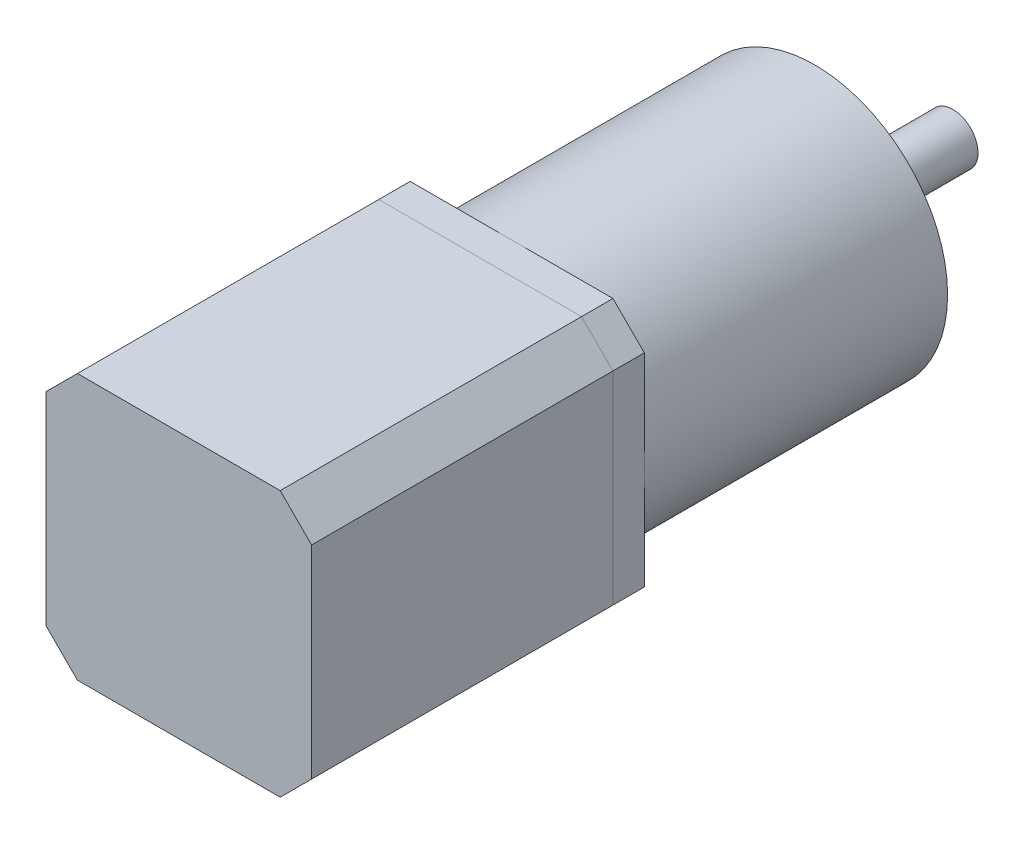
ISO-10303-21;
HEADER;
FILE_DESCRIPTION(('STEP AP214'),'2;1');
FILE_NAME('part.step','',(''),(''),'','','');
FILE_SCHEMA(('AUTOMOTIVE_DESIGN { 1 0 10303 214 1 1 1 1 }'));
ENDSEC;
DATA;
#1=APPLICATION_CONTEXT('core data for automotive mechanical design processes');
#2=APPLICATION_PROTOCOL_DEFINITION('international standard','automotive_design',2000,#1);
#3=PRODUCT_CONTEXT('',#1,'mechanical');
#4=PRODUCT('Part','Part','',(#3));
#5=PRODUCT_RELATED_PRODUCT_CATEGORY('part','',(#4));
#6=PRODUCT_DEFINITION_FORMATION('','',#4);
#7=PRODUCT_DEFINITION_CONTEXT('part definition',#1,'design');
#8=PRODUCT_DEFINITION('design','',#6,#7);
#9=PRODUCT_DEFINITION_SHAPE('','',#8);
#10=(LENGTH_UNIT() NAMED_UNIT(*) SI_UNIT(.MILLI.,.METRE.));
#11=(NAMED_UNIT(*) PLANE_ANGLE_UNIT() SI_UNIT($,.RADIAN.));
#12=(NAMED_UNIT(*) SI_UNIT($,.STERADIAN.) SOLID_ANGLE_UNIT());
#13=UNCERTAINTY_MEASURE_WITH_UNIT(LENGTH_MEASURE(1.E-05),#10,'distance_accuracy_value','');
#14=(GEOMETRIC_REPRESENTATION_CONTEXT(3) GLOBAL_UNCERTAINTY_ASSIGNED_CONTEXT((#13)) GLOBAL_UNIT_ASSIGNED_CONTEXT((#10,
#11,#12)) REPRESENTATION_CONTEXT('',''));
#15=CARTESIAN_POINT('',(0.,0.,0.));
#16=DIRECTION('',(0.,0.,1.));
#17=DIRECTION('',(1.,0.,0.));
#18=AXIS2_PLACEMENT_3D('',#15,#16,#17);
#19=CARTESIAN_POINT('',(0.,0.,-55.8));
#20=DIRECTION('',(0.,0.,1.));
#21=DIRECTION('',(1.,0.,0.));
#22=AXIS2_PLACEMENT_3D('',#19,#20,#21);
#23=CYLINDRICAL_SURFACE('',#22,6.21097509165244);
#24=CARTESIAN_POINT('',(0.,0.,-55.8));
#25=DIRECTION('',(0.,0.,-1.));
#26=DIRECTION('',(-1.,0.,0.));
#27=AXIS2_PLACEMENT_3D('',#24,#25,#26);
#28=CIRCLE('',#27,6.21097509165244);
#29=CARTESIAN_POINT('',(-6.21097509165244,0.,-55.8));
#30=VERTEX_POINT('',#29);
#31=EDGE_CURVE('E11',#30,#30,#28,.T.);
#32=ORIENTED_EDGE('',*,*,#31,.F.);
#33=EDGE_LOOP('',(#32));
#34=FACE_BOUND('',#33,.T.);
#35=CARTESIAN_POINT('',(0.,0.,-55.3));
#36=DIRECTION('',(0.,0.,-1.));
#37=DIRECTION('',(-1.,0.,0.));
#38=AXIS2_PLACEMENT_3D('',#35,#36,#37);
#39=CIRCLE('',#38,6.21097509165244);
#40=CARTESIAN_POINT('',(-6.21097509165244,0.,-55.3));
#41=VERTEX_POINT('',#40);
#42=EDGE_CURVE('E44',#41,#41,#39,.T.);
#43=ORIENTED_EDGE('',*,*,#42,.T.);
#44=EDGE_LOOP('',(#43));
#45=FACE_BOUND('',#44,.T.);
#46=ADVANCED_FACE('F41',(#34,#45),#23,.T.);
#47=CARTESIAN_POINT('',(0.,0.,-55.8));
#48=DIRECTION('',(0.,0.,-1.));
#49=DIRECTION('',(-1.,0.,0.));
#50=AXIS2_PLACEMENT_3D('',#47,#48,#49);
#51=PLANE('',#50);
#52=ORIENTED_EDGE('',*,*,#31,.T.);
#53=EDGE_LOOP('',(#52));
#54=FACE_BOUND('',#53,.T.);
#55=ADVANCED_FACE('F56',(#54),#51,.T.);
#56=CARTESIAN_POINT('',(0.,0.,-55.3));
#57=DIRECTION('',(0.,0.,-1.));
#58=DIRECTION('',(-1.,0.,0.));
#59=AXIS2_PLACEMENT_3D('',#56,#57,#58);
#60=PLANE('',#59);
#61=ORIENTED_EDGE('',*,*,#42,.F.);
#62=EDGE_LOOP('',(#61));
#63=FACE_BOUND('',#62,.T.);
#64=ADVANCED_FACE('F54',(#63),#60,.F.);
#65=CLOSED_SHELL('',(#46,#55,#64));
#66=MANIFOLD_SOLID_BREP('B2',#65);
#67=CARTESIAN_POINT('',(0.,0.,-75.3));
#68=DIRECTION('',(0.,0.,1.));
#69=DIRECTION('',(1.,0.,0.));
#70=AXIS2_PLACEMENT_3D('',#67,#68,#69);
#71=CYLINDRICAL_SURFACE('',#70,4.);
#72=CARTESIAN_POINT('',(0.,0.,-75.3));
#73=DIRECTION('',(0.,0.,-1.));
#74=DIRECTION('',(-1.,0.,0.));
#75=AXIS2_PLACEMENT_3D('',#72,#73,#74);
#76=CIRCLE('',#75,4.);
#77=CARTESIAN_POINT('',(-4.,0.,-75.3));
#78=VERTEX_POINT('',#77);
#79=EDGE_CURVE('E40',#78,#78,#76,.T.);
#80=ORIENTED_EDGE('',*,*,#79,.F.);
#81=EDGE_LOOP('',(#80));
#82=FACE_BOUND('',#81,.T.);
#83=CARTESIAN_POINT('',(0.,0.,-55.3));
#84=DIRECTION('',(0.,0.,-1.));
#85=DIRECTION('',(-1.,0.,0.));
#86=AXIS2_PLACEMENT_3D('',#83,#84,#85);
#87=CIRCLE('',#86,4.);
#88=CARTESIAN_POINT('',(-4.,0.,-55.3));
#89=VERTEX_POINT('',#88);
#90=EDGE_CURVE('E92',#89,#89,#87,.T.);
#91=ORIENTED_EDGE('',*,*,#90,.T.);
#92=EDGE_LOOP('',(#91));
#93=FACE_BOUND('',#92,.T.);
#94=ADVANCED_FACE('F89',(#82,#93),#71,.T.);
#95=CARTESIAN_POINT('',(0.,0.,-75.3));
#96=DIRECTION('',(0.,0.,-1.));
#97=DIRECTION('',(-1.,0.,0.));
#98=AXIS2_PLACEMENT_3D('',#95,#96,#97);
#99=PLANE('',#98);
#100=ORIENTED_EDGE('',*,*,#79,.T.);
#101=EDGE_LOOP('',(#100));
#102=FACE_BOUND('',#101,.T.);
#103=ADVANCED_FACE('F104',(#102),#99,.T.);
#104=CARTESIAN_POINT('',(0.,0.,-55.3));
#105=DIRECTION('',(0.,0.,-1.));
#106=DIRECTION('',(-1.,0.,0.));
#107=AXIS2_PLACEMENT_3D('',#104,#105,#106);
#108=PLANE('',#107);
#109=ORIENTED_EDGE('',*,*,#90,.F.);
#110=EDGE_LOOP('',(#109));
#111=FACE_BOUND('',#110,.T.);
#112=ADVANCED_FACE('F102',(#111),#108,.F.);
#113=CLOSED_SHELL('',(#94,#103,#112));
#114=MANIFOLD_SOLID_BREP('B6',#113);
#115=CARTESIAN_POINT('',(0.,0.,-55.3));
#116=DIRECTION('',(0.,0.,1.));
#117=DIRECTION('',(1.,0.,0.));
#118=AXIS2_PLACEMENT_3D('',#115,#116,#117);
#119=CYLINDRICAL_SURFACE('',#118,11.);
#120=CARTESIAN_POINT('',(0.,0.,-55.3));
#121=DIRECTION('',(0.,0.,-1.));
#122=DIRECTION('',(-1.,0.,0.));
#123=AXIS2_PLACEMENT_3D('',#120,#121,#122);
#124=CIRCLE('',#123,11.);
#125=CARTESIAN_POINT('',(-11.,0.,-55.3));
#126=VERTEX_POINT('',#125);
#127=EDGE_CURVE('E88',#126,#126,#124,.T.);
#128=ORIENTED_EDGE('',*,*,#127,.F.);
#129=EDGE_LOOP('',(#128));
#130=FACE_BOUND('',#129,.T.);
#131=CARTESIAN_POINT('',(0.,0.,-53.3));
#132=DIRECTION('',(0.,0.,-1.));
#133=DIRECTION('',(-1.,0.,0.));
#134=AXIS2_PLACEMENT_3D('',#131,#132,#133);
#135=CIRCLE('',#134,11.);
#136=CARTESIAN_POINT('',(-11.,0.,-53.3));
#137=VERTEX_POINT('',#136);
#138=EDGE_CURVE('E140',#137,#137,#135,.T.);
#139=ORIENTED_EDGE('',*,*,#138,.T.);
#140=EDGE_LOOP('',(#139));
#141=FACE_BOUND('',#140,.T.);
#142=ADVANCED_FACE('F137',(#130,#141),#119,.T.);
#143=CARTESIAN_POINT('',(0.,0.,-55.3));
#144=DIRECTION('',(0.,0.,-1.));
#145=DIRECTION('',(-1.,0.,0.));
#146=AXIS2_PLACEMENT_3D('',#143,#144,#145);
#147=PLANE('',#146);
#148=ORIENTED_EDGE('',*,*,#127,.T.);
#149=EDGE_LOOP('',(#148));
#150=FACE_BOUND('',#149,.T.);
#151=ADVANCED_FACE('F152',(#150),#147,.T.);
#152=CARTESIAN_POINT('',(0.,0.,-53.3));
#153=DIRECTION('',(0.,0.,-1.));
#154=DIRECTION('',(-1.,0.,0.));
#155=AXIS2_PLACEMENT_3D('',#152,#153,#154);
#156=PLANE('',#155);
#157=ORIENTED_EDGE('',*,*,#138,.F.);
#158=EDGE_LOOP('',(#157));
#159=FACE_BOUND('',#158,.T.);
#160=ADVANCED_FACE('F150',(#159),#156,.F.);
#161=CLOSED_SHELL('',(#142,#151,#160));
#162=MANIFOLD_SOLID_BREP('B35',#161);
#163=CARTESIAN_POINT('',(0.,0.,-53.3));
#164=DIRECTION('',(0.,0.,1.));
#165=DIRECTION('',(1.,0.,0.));
#166=AXIS2_PLACEMENT_3D('',#163,#164,#165);
#167=CYLINDRICAL_SURFACE('',#166,21.15);
#168=CARTESIAN_POINT('',(0.,0.,-53.3));
#169=DIRECTION('',(0.,0.,-1.));
#170=DIRECTION('',(-1.,0.,0.));
#171=AXIS2_PLACEMENT_3D('',#168,#169,#170);
#172=CIRCLE('',#171,21.15);
#173=CARTESIAN_POINT('',(21.15,0.,-53.3));
#174=VERTEX_POINT('',#173);
#175=EDGE_CURVE('E136',#174,#174,#172,.T.);
#176=CARTESIAN_POINT('',(0.,0.,-5.));
#177=DIRECTION('',(0.,0.,-1.));
#178=DIRECTION('',(-1.,0.,0.));
#179=AXIS2_PLACEMENT_3D('',#176,#177,#178);
#180=CIRCLE('',#179,21.15);
#181=CARTESIAN_POINT('',(21.15,0.,-5.));
#182=VERTEX_POINT('',#181);
#183=EDGE_CURVE('E190',#182,#182,#180,.T.);
#184=CARTESIAN_POINT('',(21.15,0.,-53.3));
#185=CARTESIAN_POINT('',(21.15,0.,-52.796875));
#186=CARTESIAN_POINT('',(21.15,0.,-52.29375));
#187=CARTESIAN_POINT('',(21.15,0.,-51.2875));
#188=CARTESIAN_POINT('',(21.15,0.,-50.784375));
#189=CARTESIAN_POINT('',(21.15,0.,-49.778125));
#190=CARTESIAN_POINT('',(21.15,0.,-49.275));
#191=CARTESIAN_POINT('',(21.15,0.,-48.26875));
#192=CARTESIAN_POINT('',(21.15,0.,-47.765625));
#193=CARTESIAN_POINT('',(21.15,0.,-46.759375));
#194=CARTESIAN_POINT('',(21.15,0.,-46.25625));
#195=CARTESIAN_POINT('',(21.15,0.,-45.25));
#196=CARTESIAN_POINT('',(21.15,0.,-44.746875));
#197=CARTESIAN_POINT('',(21.15,0.,-43.740625));
#198=CARTESIAN_POINT('',(21.15,0.,-43.2375));
#199=CARTESIAN_POINT('',(21.15,0.,-42.23125));
#200=CARTESIAN_POINT('',(21.15,0.,-41.728125));
#201=CARTESIAN_POINT('',(21.15,0.,-40.721875));
#202=CARTESIAN_POINT('',(21.15,0.,-40.21875));
#203=CARTESIAN_POINT('',(21.15,0.,-39.2125));
#204=CARTESIAN_POINT('',(21.15,0.,-38.709375));
#205=CARTESIAN_POINT('',(21.15,0.,-37.703125));
#206=CARTESIAN_POINT('',(21.15,0.,-37.2));
#207=CARTESIAN_POINT('',(21.15,0.,-36.19375));
#208=CARTESIAN_POINT('',(21.15,0.,-35.690625));
#209=CARTESIAN_POINT('',(21.15,0.,-34.684375));
#210=CARTESIAN_POINT('',(21.15,0.,-34.18125));
#211=CARTESIAN_POINT('',(21.15,0.,-33.175));
#212=CARTESIAN_POINT('',(21.15,0.,-32.671875));
#213=CARTESIAN_POINT('',(21.15,0.,-31.665625));
#214=CARTESIAN_POINT('',(21.15,0.,-31.1625));
#215=CARTESIAN_POINT('',(21.15,0.,-30.15625));
#216=CARTESIAN_POINT('',(21.15,0.,-29.653125));
#217=CARTESIAN_POINT('',(21.15,0.,-28.646875));
#218=CARTESIAN_POINT('',(21.15,0.,-28.14375));
#219=CARTESIAN_POINT('',(21.15,0.,-27.1375));
#220=CARTESIAN_POINT('',(21.15,0.,-26.634375));
#221=CARTESIAN_POINT('',(21.15,0.,-25.628125));
#222=CARTESIAN_POINT('',(21.15,0.,-25.125));
#223=CARTESIAN_POINT('',(21.15,0.,-24.11875));
#224=CARTESIAN_POINT('',(21.15,0.,-23.615625));
#225=CARTESIAN_POINT('',(21.15,0.,-22.609375));
#226=CARTESIAN_POINT('',(21.15,0.,-22.10625));
#227=CARTESIAN_POINT('',(21.15,0.,-21.1));
#228=CARTESIAN_POINT('',(21.15,0.,-20.596875));
#229=CARTESIAN_POINT('',(21.15,0.,-19.590625));
#230=CARTESIAN_POINT('',(21.15,0.,-19.0875));
#231=CARTESIAN_POINT('',(21.15,0.,-18.08125));
#232=CARTESIAN_POINT('',(21.15,0.,-17.578125));
#233=CARTESIAN_POINT('',(21.15,0.,-16.571875));
#234=CARTESIAN_POINT('',(21.15,0.,-16.06875));
#235=CARTESIAN_POINT('',(21.15,0.,-15.0625));
#236=CARTESIAN_POINT('',(21.15,0.,-14.559375));
#237=CARTESIAN_POINT('',(21.15,0.,-13.553125));
#238=CARTESIAN_POINT('',(21.15,0.,-13.05));
#239=CARTESIAN_POINT('',(21.15,0.,-12.04375));
#240=CARTESIAN_POINT('',(21.15,0.,-11.540625));
#241=CARTESIAN_POINT('',(21.15,0.,-10.534375));
#242=CARTESIAN_POINT('',(21.15,0.,-10.03125));
#243=CARTESIAN_POINT('',(21.15,0.,-9.02500000000001));
#244=CARTESIAN_POINT('',(21.15,0.,-8.521875));
#245=CARTESIAN_POINT('',(21.15,0.,-7.51562500000001));
#246=CARTESIAN_POINT('',(21.15,0.,-7.0125));
#247=CARTESIAN_POINT('',(21.15,0.,-6.00625));
#248=CARTESIAN_POINT('',(21.15,0.,-5.503125));
#249=CARTESIAN_POINT('',(21.15,0.,-5.));
#250=B_SPLINE_CURVE_WITH_KNOTS('',3,(#184,#185,#186,#187,#188,#189,#190,#191,#192,#193,#194,
#195,#196,#197,#198,#199,#200,#201,#202,#203,#204,#205,#206,#207,#208,#209,#210,#211,#212,#213,
#214,#215,#216,#217,#218,#219,#220,#221,#222,#223,#224,#225,#226,#227,#228,#229,#230,#231,#232,
#233,#234,#235,#236,#237,#238,#239,#240,#241,#242,#243,#244,#245,#246,#247,#248,#249),
.UNSPECIFIED.,.F.,.F.,(4,2,2,2,2,2,2,2,2,2,2,2,2,2,2,2,2,2,2,2,2,2,2,2,2,2,2,2,2,2,2,2,4),(0.,
1.509375,3.01875,4.528125,6.0375,7.546875,9.05625,10.565625,12.075,13.584375,15.09375,16.603125,
18.1125,19.621875,21.13125,22.640625,24.15,25.659375,27.16875,28.678125,30.1875,31.696875,
33.20625,34.715625,36.225,37.734375,39.24375,40.753125,42.2625,43.771875,45.28125,46.790625,
48.3),.UNSPECIFIED.);
#251=EDGE_CURVE('BSEAM187',#174,#182,#250,.T.);
#252=ORIENTED_EDGE('',*,*,#175,.F.);
#253=ORIENTED_EDGE('',*,*,#183,.T.);
#254=ORIENTED_EDGE('',*,*,#251,.T.);
#255=ORIENTED_EDGE('',*,*,#251,.F.);
#256=EDGE_LOOP('',(#252,#254,#253,#255));
#257=FACE_BOUND('',#256,.T.);
#258=ADVANCED_FACE('F187',(#257),#167,.T.);
#259=CARTESIAN_POINT('',(0.,0.,-53.3));
#260=DIRECTION('',(0.,0.,-1.));
#261=DIRECTION('',(-1.,0.,0.));
#262=AXIS2_PLACEMENT_3D('',#259,#260,#261);
#263=PLANE('',#262);
#264=CARTESIAN_POINT('',(17.5,0.,-53.3));
#265=DIRECTION('',(0.,0.,-1.));
#266=DIRECTION('',(-1.,0.,0.));
#267=AXIS2_PLACEMENT_3D('',#264,#265,#266);
#268=CIRCLE('',#267,1.5);
#269=CARTESIAN_POINT('',(16.,0.,-53.3));
#270=VERTEX_POINT('',#269);
#271=EDGE_CURVE('E217',#270,#270,#268,.T.);
#272=ORIENTED_EDGE('',*,*,#271,.F.);
#273=EDGE_LOOP('',(#272));
#274=FACE_BOUND('',#273,.T.);
#275=CARTESIAN_POINT('',(0.,17.5,-53.3));
#276=DIRECTION('',(0.,0.,-1.));
#277=DIRECTION('',(-1.,0.,0.));
#278=AXIS2_PLACEMENT_3D('',#275,#276,#277);
#279=CIRCLE('',#278,1.5);
#280=CARTESIAN_POINT('',(-1.50000000000006,17.5,-53.3));
#281=VERTEX_POINT('',#280);
#282=EDGE_CURVE('E211',#281,#281,#279,.T.);
#283=ORIENTED_EDGE('',*,*,#282,.F.);
#284=EDGE_LOOP('',(#283));
#285=FACE_BOUND('',#284,.T.);
#286=CARTESIAN_POINT('',(-17.5,-1.2220184685951E-13,-53.3));
#287=DIRECTION('',(0.,0.,-1.));
#288=DIRECTION('',(-1.,0.,0.));
#289=AXIS2_PLACEMENT_3D('',#286,#287,#288);
#290=CIRCLE('',#289,1.5);
#291=CARTESIAN_POINT('',(-19.,-1.2220184685951E-13,-53.3));
#292=VERTEX_POINT('',#291);
#293=EDGE_CURVE('E205',#292,#292,#290,.T.);
#294=ORIENTED_EDGE('',*,*,#293,.F.);
#295=EDGE_LOOP('',(#294));
#296=FACE_BOUND('',#295,.T.);
#297=CARTESIAN_POINT('',(1.83302770289265E-13,-17.5,-53.3));
#298=DIRECTION('',(0.,0.,-1.));
#299=DIRECTION('',(-1.,0.,0.));
#300=AXIS2_PLACEMENT_3D('',#297,#298,#299);
#301=CIRCLE('',#300,1.5);
#302=CARTESIAN_POINT('',(-1.49999999999982,-17.5,-53.3));
#303=VERTEX_POINT('',#302);
#304=EDGE_CURVE('E199',#303,#303,#301,.T.);
#305=ORIENTED_EDGE('',*,*,#304,.F.);
#306=EDGE_LOOP('',(#305));
#307=FACE_BOUND('',#306,.T.);
#308=ORIENTED_EDGE('',*,*,#175,.T.);
#309=EDGE_LOOP('',(#308));
#310=FACE_BOUND('',#309,.T.);
#311=ADVANCED_FACE('F232',(#274,#285,#296,#307,#310),#263,.T.);
#312=CARTESIAN_POINT('',(0.,0.,-5.));
#313=DIRECTION('',(0.,0.,-1.));
#314=DIRECTION('',(-1.,0.,0.));
#315=AXIS2_PLACEMENT_3D('',#312,#313,#314);
#316=PLANE('',#315);
#317=ORIENTED_EDGE('',*,*,#183,.F.);
#318=EDGE_LOOP('',(#317));
#319=FACE_BOUND('',#318,.T.);
#320=ADVANCED_FACE('F235',(#319),#316,.F.);
#321=CARTESIAN_POINT('',(1.83302770289265E-13,-17.5,-43.3));
#322=DIRECTION('',(0.,0.,-1.));
#323=DIRECTION('',(-1.,0.,0.));
#324=AXIS2_PLACEMENT_3D('',#321,#322,#323);
#325=CYLINDRICAL_SURFACE('',#324,1.5);
#326=CARTESIAN_POINT('',(1.83302770289265E-13,-17.5,-43.3));
#327=DIRECTION('',(0.,0.,-1.));
#328=DIRECTION('',(-1.,0.,0.));
#329=AXIS2_PLACEMENT_3D('',#326,#327,#328);
#330=CIRCLE('',#329,1.5);
#331=CARTESIAN_POINT('',(-1.49999999999982,-17.5,-43.3));
#332=VERTEX_POINT('',#331);
#333=EDGE_CURVE('E202',#332,#332,#330,.T.);
#334=ORIENTED_EDGE('',*,*,#333,.F.);
#335=EDGE_LOOP('',(#334));
#336=FACE_BOUND('',#335,.T.);
#337=ORIENTED_EDGE('',*,*,#304,.T.);
#338=EDGE_LOOP('',(#337));
#339=FACE_BOUND('',#338,.T.);
#340=ADVANCED_FACE('F243',(#336,#339),#325,.F.);
#341=CARTESIAN_POINT('',(1.83302770289265E-13,-17.5,-43.3));
#342=DIRECTION('',(0.,0.,-1.));
#343=DIRECTION('',(-1.,0.,0.));
#344=AXIS2_PLACEMENT_3D('',#341,#342,#343);
#345=PLANE('',#344);
#346=ORIENTED_EDGE('',*,*,#333,.T.);
#347=EDGE_LOOP('',(#346));
#348=FACE_BOUND('',#347,.T.);
#349=ADVANCED_FACE('F245',(#348),#345,.T.);
#350=CARTESIAN_POINT('',(-17.5,-1.2220184685951E-13,-43.3));
#351=DIRECTION('',(0.,0.,-1.));
#352=DIRECTION('',(-1.,0.,0.));
#353=AXIS2_PLACEMENT_3D('',#350,#351,#352);
#354=CYLINDRICAL_SURFACE('',#353,1.5);
#355=CARTESIAN_POINT('',(-17.5,-1.2220184685951E-13,-43.3));
#356=DIRECTION('',(0.,0.,-1.));
#357=DIRECTION('',(-1.,0.,0.));
#358=AXIS2_PLACEMENT_3D('',#355,#356,#357);
#359=CIRCLE('',#358,1.5);
#360=CARTESIAN_POINT('',(-19.,-1.2220184685951E-13,-43.3));
#361=VERTEX_POINT('',#360);
#362=EDGE_CURVE('E208',#361,#361,#359,.T.);
#363=ORIENTED_EDGE('',*,*,#362,.F.);
#364=EDGE_LOOP('',(#363));
#365=FACE_BOUND('',#364,.T.);
#366=ORIENTED_EDGE('',*,*,#293,.T.);
#367=EDGE_LOOP('',(#366));
#368=FACE_BOUND('',#367,.T.);
#369=ADVANCED_FACE('F252',(#365,#368),#354,.F.);
#370=CARTESIAN_POINT('',(-17.5,-1.2220184685951E-13,-43.3));
#371=DIRECTION('',(0.,0.,-1.));
#372=DIRECTION('',(-1.,0.,0.));
#373=AXIS2_PLACEMENT_3D('',#370,#371,#372);
#374=PLANE('',#373);
#375=ORIENTED_EDGE('',*,*,#362,.T.);
#376=EDGE_LOOP('',(#375));
#377=FACE_BOUND('',#376,.T.);
#378=ADVANCED_FACE('F292',(#377),#374,.T.);
#379=CARTESIAN_POINT('',(0.,17.5,-43.3));
#380=DIRECTION('',(0.,0.,-1.));
#381=DIRECTION('',(-1.,0.,0.));
#382=AXIS2_PLACEMENT_3D('',#379,#380,#381);
#383=CYLINDRICAL_SURFACE('',#382,1.5);
#384=CARTESIAN_POINT('',(0.,17.5,-43.3));
#385=DIRECTION('',(0.,0.,-1.));
#386=DIRECTION('',(-1.,0.,0.));
#387=AXIS2_PLACEMENT_3D('',#384,#385,#386);
#388=CIRCLE('',#387,1.5);
#389=CARTESIAN_POINT('',(-1.50000000000006,17.5,-43.3));
#390=VERTEX_POINT('',#389);
#391=EDGE_CURVE('E214',#390,#390,#388,.T.);
#392=ORIENTED_EDGE('',*,*,#391,.F.);
#393=EDGE_LOOP('',(#392));
#394=FACE_BOUND('',#393,.T.);
#395=ORIENTED_EDGE('',*,*,#282,.T.);
#396=EDGE_LOOP('',(#395));
#397=FACE_BOUND('',#396,.T.);
#398=ADVANCED_FACE('F301',(#394,#397),#383,.F.);
#399=CARTESIAN_POINT('',(0.,17.5,-43.3));
#400=DIRECTION('',(0.,0.,-1.));
#401=DIRECTION('',(-1.,0.,0.));
#402=AXIS2_PLACEMENT_3D('',#399,#400,#401);
#403=PLANE('',#402);
#404=ORIENTED_EDGE('',*,*,#391,.T.);
#405=EDGE_LOOP('',(#404));
#406=FACE_BOUND('',#405,.T.);
#407=ADVANCED_FACE('F228',(#406),#403,.T.);
#408=CARTESIAN_POINT('',(17.5,0.,-43.3));
#409=DIRECTION('',(0.,0.,-1.));
#410=DIRECTION('',(-1.,0.,0.));
#411=AXIS2_PLACEMENT_3D('',#408,#409,#410);
#412=CYLINDRICAL_SURFACE('',#411,1.5);
#413=CARTESIAN_POINT('',(17.5,0.,-43.3));
#414=DIRECTION('',(0.,0.,-1.));
#415=DIRECTION('',(-1.,0.,0.));
#416=AXIS2_PLACEMENT_3D('',#413,#414,#415);
#417=CIRCLE('',#416,1.5);
#418=CARTESIAN_POINT('',(16.,0.,-43.3));
#419=VERTEX_POINT('',#418);
#420=EDGE_CURVE('E197',#419,#419,#417,.T.);
#421=ORIENTED_EDGE('',*,*,#420,.F.);
#422=EDGE_LOOP('',(#421));
#423=FACE_BOUND('',#422,.T.);
#424=ORIENTED_EDGE('',*,*,#271,.T.);
#425=EDGE_LOOP('',(#424));
#426=FACE_BOUND('',#425,.T.);
#427=ADVANCED_FACE('F225',(#423,#426),#412,.F.);
#428=CARTESIAN_POINT('',(17.5,0.,-43.3));
#429=DIRECTION('',(0.,0.,-1.));
#430=DIRECTION('',(-1.,0.,0.));
#431=AXIS2_PLACEMENT_3D('',#428,#429,#430);
#432=PLANE('',#431);
#433=ORIENTED_EDGE('',*,*,#420,.T.);
#434=EDGE_LOOP('',(#433));
#435=FACE_BOUND('',#434,.T.);
#436=ADVANCED_FACE('F223',(#435),#432,.T.);
#437=CLOSED_SHELL('',(#258,#311,#320,#340,#349,#369,#378,#398,#407,#427,#436));
#438=MANIFOLD_SOLID_BREP('B83',#437);
#439=CARTESIAN_POINT('',(-21.15,-21.15,-5.));
#440=DIRECTION('',(1.,0.,0.));
#441=DIRECTION('',(0.,0.,-1.));
#442=AXIS2_PLACEMENT_3D('',#439,#440,#441);
#443=PLANE('',#442);
#444=DIRECTION('',(0.,1.,0.));
#445=VECTOR('',#444,1.);
#446=CARTESIAN_POINT('',(-21.15,-21.15,-5.));
#447=LINE('',#446,#445);
#448=CARTESIAN_POINT('',(-21.15,-16.15,-5.));
#449=VERTEX_POINT('',#448);
#450=CARTESIAN_POINT('',(-21.15,16.15,-5.));
#451=VERTEX_POINT('',#450);
#452=EDGE_CURVE('E447',#449,#451,#447,.T.);
#453=ORIENTED_EDGE('',*,*,#452,.F.);
#454=DIRECTION('',(0.,0.,1.));
#455=VECTOR('',#454,1.);
#456=CARTESIAN_POINT('',(-21.15,-16.15,-5.));
#457=LINE('',#456,#455);
#458=CARTESIAN_POINT('',(-21.15,-16.15,0.));
#459=VERTEX_POINT('',#458);
#460=EDGE_CURVE('E473',#449,#459,#457,.T.);
#461=ORIENTED_EDGE('',*,*,#460,.T.);
#462=DIRECTION('',(0.,1.,0.));
#463=VECTOR('',#462,1.);
#464=CARTESIAN_POINT('',(-21.15,-21.15,0.));
#465=LINE('',#464,#463);
#466=CARTESIAN_POINT('',(-21.15,16.15,0.));
#467=VERTEX_POINT('',#466);
#468=EDGE_CURVE('E481',#459,#467,#465,.T.);
#469=ORIENTED_EDGE('',*,*,#468,.T.);
#470=DIRECTION('',(0.,0.,-1.));
#471=VECTOR('',#470,1.);
#472=CARTESIAN_POINT('',(-21.15,16.15,-5.));
#473=LINE('',#472,#471);
#474=EDGE_CURVE('E471',#467,#451,#473,.T.);
#475=ORIENTED_EDGE('',*,*,#474,.T.);
#476=EDGE_LOOP('',(#453,#461,#469,#475));
#477=FACE_BOUND('',#476,.T.);
#478=ADVANCED_FACE('F356',(#477),#443,.F.);
#479=CARTESIAN_POINT('',(21.15,21.15,-5.));
#480=DIRECTION('',(0.,-1.,0.));
#481=DIRECTION('',(0.,0.,-1.));
#482=AXIS2_PLACEMENT_3D('',#479,#480,#481);
#483=PLANE('',#482);
#484=DIRECTION('',(1.,0.,0.));
#485=VECTOR('',#484,1.);
#486=CARTESIAN_POINT('',(21.15,21.15,0.));
#487=LINE('',#486,#485);
#488=CARTESIAN_POINT('',(-16.15,21.15,0.));
#489=VERTEX_POINT('',#488);
#490=CARTESIAN_POINT('',(16.15,21.15,0.));
#491=VERTEX_POINT('',#490);
#492=EDGE_CURVE('E452',#489,#491,#487,.T.);
#493=ORIENTED_EDGE('',*,*,#492,.T.);
#494=DIRECTION('',(0.,0.,-1.));
#495=VECTOR('',#494,1.);
#496=CARTESIAN_POINT('',(16.15,21.15,-5.));
#497=LINE('',#496,#495);
#498=CARTESIAN_POINT('',(16.15,21.15,-5.));
#499=VERTEX_POINT('',#498);
#500=EDGE_CURVE('E185',#491,#499,#497,.T.);
#501=ORIENTED_EDGE('',*,*,#500,.T.);
#502=DIRECTION('',(1.,0.,0.));
#503=VECTOR('',#502,1.);
#504=CARTESIAN_POINT('',(21.15,21.15,-5.));
#505=LINE('',#504,#503);
#506=CARTESIAN_POINT('',(-16.15,21.15,-5.));
#507=VERTEX_POINT('',#506);
#508=EDGE_CURVE('E450',#507,#499,#505,.T.);
#509=ORIENTED_EDGE('',*,*,#508,.F.);
#510=DIRECTION('',(0.,0.,1.));
#511=VECTOR('',#510,1.);
#512=CARTESIAN_POINT('',(-16.15,21.15,-5.));
#513=LINE('',#512,#511);
#514=EDGE_CURVE('E364',#507,#489,#513,.T.);
#515=ORIENTED_EDGE('',*,*,#514,.T.);
#516=EDGE_LOOP('',(#493,#501,#509,#515));
#517=FACE_BOUND('',#516,.T.);
#518=ADVANCED_FACE('F478',(#517),#483,.F.);
#519=CARTESIAN_POINT('',(21.15,-21.15,-5.));
#520=DIRECTION('',(-1.,0.,0.));
#521=DIRECTION('',(0.,0.,1.));
#522=AXIS2_PLACEMENT_3D('',#519,#520,#521);
#523=PLANE('',#522);
#524=DIRECTION('',(0.,-1.,0.));
#525=VECTOR('',#524,1.);
#526=CARTESIAN_POINT('',(21.15,-21.15,0.));
#527=LINE('',#526,#525);
#528=CARTESIAN_POINT('',(21.15,16.15,0.));
#529=VERTEX_POINT('',#528);
#530=CARTESIAN_POINT('',(21.15,-16.15,0.));
#531=VERTEX_POINT('',#530);
#532=EDGE_CURVE('E448',#529,#531,#527,.T.);
#533=ORIENTED_EDGE('',*,*,#532,.T.);
#534=DIRECTION('',(0.,0.,-1.));
#535=VECTOR('',#534,1.);
#536=CARTESIAN_POINT('',(21.15,-16.15,-5.));
#537=LINE('',#536,#535);
#538=CARTESIAN_POINT('',(21.15,-16.15,-5.));
#539=VERTEX_POINT('',#538);
#540=EDGE_CURVE('E426',#531,#539,#537,.T.);
#541=ORIENTED_EDGE('',*,*,#540,.T.);
#542=DIRECTION('',(0.,-1.,0.));
#543=VECTOR('',#542,1.);
#544=CARTESIAN_POINT('',(21.15,-21.15,-5.));
#545=LINE('',#544,#543);
#546=CARTESIAN_POINT('',(21.15,16.15,-5.));
#547=VERTEX_POINT('',#546);
#548=EDGE_CURVE('E485',#547,#539,#545,.T.);
#549=ORIENTED_EDGE('',*,*,#548,.F.);
#550=DIRECTION('',(0.,0.,1.));
#551=VECTOR('',#550,1.);
#552=CARTESIAN_POINT('',(21.15,16.15,-5.));
#553=LINE('',#552,#551);
#554=EDGE_CURVE('E431',#547,#529,#553,.T.);
#555=ORIENTED_EDGE('',*,*,#554,.T.);
#556=EDGE_LOOP('',(#533,#541,#549,#555));
#557=FACE_BOUND('',#556,.T.);
#558=ADVANCED_FACE('F495',(#557),#523,.F.);
#559=CARTESIAN_POINT('',(21.15,-21.15,-5.));
#560=DIRECTION('',(0.,1.,0.));
#561=DIRECTION('',(0.,0.,1.));
#562=AXIS2_PLACEMENT_3D('',#559,#560,#561);
#563=PLANE('',#562);
#564=DIRECTION('',(-1.,0.,0.));
#565=VECTOR('',#564,1.);
#566=CARTESIAN_POINT('',(21.15,-21.15,-5.));
#567=LINE('',#566,#565);
#568=CARTESIAN_POINT('',(16.15,-21.15,-5.));
#569=VERTEX_POINT('',#568);
#570=CARTESIAN_POINT('',(-16.15,-21.15,-5.));
#571=VERTEX_POINT('',#570);
#572=EDGE_CURVE('E441',#569,#571,#567,.T.);
#573=ORIENTED_EDGE('',*,*,#572,.F.);
#574=DIRECTION('',(0.,0.,1.));
#575=VECTOR('',#574,1.);
#576=CARTESIAN_POINT('',(16.15,-21.15,-5.));
#577=LINE('',#576,#575);
#578=CARTESIAN_POINT('',(16.15,-21.15,0.));
#579=VERTEX_POINT('',#578);
#580=EDGE_CURVE('E425',#569,#579,#577,.T.);
#581=ORIENTED_EDGE('',*,*,#580,.T.);
#582=DIRECTION('',(-1.,0.,0.));
#583=VECTOR('',#582,1.);
#584=CARTESIAN_POINT('',(21.15,-21.15,0.));
#585=LINE('',#584,#583);
#586=CARTESIAN_POINT('',(-16.15,-21.15,0.));
#587=VERTEX_POINT('',#586);
#588=EDGE_CURVE('E438',#579,#587,#585,.T.);
#589=ORIENTED_EDGE('',*,*,#588,.T.);
#590=DIRECTION('',(0.,0.,-1.));
#591=VECTOR('',#590,1.);
#592=CARTESIAN_POINT('',(-16.15,-21.15,-5.));
#593=LINE('',#592,#591);
#594=EDGE_CURVE('E443',#587,#571,#593,.T.);
#595=ORIENTED_EDGE('',*,*,#594,.T.);
#596=EDGE_LOOP('',(#573,#581,#589,#595));
#597=FACE_BOUND('',#596,.T.);
#598=ADVANCED_FACE('F437',(#597),#563,.F.);
#599=CARTESIAN_POINT('',(0.,0.,-5.));
#600=DIRECTION('',(0.,0.,1.));
#601=DIRECTION('',(1.,0.,0.));
#602=AXIS2_PLACEMENT_3D('',#599,#600,#601);
#603=PLANE('',#602);
#604=ORIENTED_EDGE('',*,*,#548,.T.);
#605=DIRECTION('',(0.707106781186546,0.707106781186549,0.));
#606=VECTOR('',#605,1.);
#607=CARTESIAN_POINT('',(16.15,-21.15,-5.));
#608=LINE('',#607,#606);
#609=EDGE_CURVE('E469',#539,#569,#608,.F.);
#610=ORIENTED_EDGE('',*,*,#609,.T.);
#611=ORIENTED_EDGE('',*,*,#572,.T.);
#612=DIRECTION('',(0.707106781186549,-0.707106781186546,0.));
#613=VECTOR('',#612,1.);
#614=CARTESIAN_POINT('',(-21.15,-16.15,-5.));
#615=LINE('',#614,#613);
#616=EDGE_CURVE('E467',#571,#449,#615,.F.);
#617=ORIENTED_EDGE('',*,*,#616,.T.);
#618=ORIENTED_EDGE('',*,*,#452,.T.);
#619=DIRECTION('',(-0.707106781186546,-0.707106781186549,0.));
#620=VECTOR('',#619,1.);
#621=CARTESIAN_POINT('',(-16.15,21.15,-5.));
#622=LINE('',#621,#620);
#623=EDGE_CURVE('E376',#451,#507,#622,.F.);
#624=ORIENTED_EDGE('',*,*,#623,.T.);
#625=ORIENTED_EDGE('',*,*,#508,.T.);
#626=DIRECTION('',(-0.707106781186549,0.707106781186546,0.));
#627=VECTOR('',#626,1.);
#628=CARTESIAN_POINT('',(21.15,16.15,-5.));
#629=LINE('',#628,#627);
#630=EDGE_CURVE('E465',#499,#547,#629,.F.);
#631=ORIENTED_EDGE('',*,*,#630,.T.);
#632=EDGE_LOOP('',(#604,#610,#611,#617,#618,#624,#625,#631));
#633=FACE_BOUND('',#632,.T.);
#634=ADVANCED_FACE('F489',(#633),#603,.F.);
#635=CARTESIAN_POINT('',(0.,0.,0.));
#636=DIRECTION('',(0.,0.,1.));
#637=DIRECTION('',(1.,0.,0.));
#638=AXIS2_PLACEMENT_3D('',#635,#636,#637);
#639=PLANE('',#638);
#640=ORIENTED_EDGE('',*,*,#588,.F.);
#641=DIRECTION('',(-0.707106781186546,-0.707106781186549,0.));
#642=VECTOR('',#641,1.);
#643=CARTESIAN_POINT('',(18.65,-18.65,0.));
#644=LINE('',#643,#642);
#645=EDGE_CURVE('E421',#579,#531,#644,.F.);
#646=ORIENTED_EDGE('',*,*,#645,.T.);
#647=ORIENTED_EDGE('',*,*,#532,.F.);
#648=DIRECTION('',(0.707106781186549,-0.707106781186546,0.));
#649=VECTOR('',#648,1.);
#650=CARTESIAN_POINT('',(18.65,18.65,0.));
#651=LINE('',#650,#649);
#652=EDGE_CURVE('E458',#529,#491,#651,.F.);
#653=ORIENTED_EDGE('',*,*,#652,.T.);
#654=ORIENTED_EDGE('',*,*,#492,.F.);
#655=DIRECTION('',(0.707106781186546,0.707106781186549,0.));
#656=VECTOR('',#655,1.);
#657=CARTESIAN_POINT('',(-18.65,18.65,0.));
#658=LINE('',#657,#656);
#659=EDGE_CURVE('E442',#489,#467,#658,.F.);
#660=ORIENTED_EDGE('',*,*,#659,.T.);
#661=ORIENTED_EDGE('',*,*,#468,.F.);
#662=DIRECTION('',(-0.707106781186549,0.707106781186546,0.));
#663=VECTOR('',#662,1.);
#664=CARTESIAN_POINT('',(-18.65,-18.65,0.));
#665=LINE('',#664,#663);
#666=EDGE_CURVE('E432',#459,#587,#665,.F.);
#667=ORIENTED_EDGE('',*,*,#666,.T.);
#668=EDGE_LOOP('',(#640,#646,#647,#653,#654,#660,#661,#667));
#669=FACE_BOUND('',#668,.T.);
#670=ADVANCED_FACE('F445',(#669),#639,.T.);
#671=CARTESIAN_POINT('',(16.15,-21.15,-5.));
#672=DIRECTION('',(-0.707106781186549,0.707106781186546,0.));
#673=DIRECTION('',(0.,0.,1.));
#674=AXIS2_PLACEMENT_3D('',#671,#672,#673);
#675=PLANE('',#674);
#676=ORIENTED_EDGE('',*,*,#609,.F.);
#677=ORIENTED_EDGE('',*,*,#540,.F.);
#678=ORIENTED_EDGE('',*,*,#645,.F.);
#679=ORIENTED_EDGE('',*,*,#580,.F.);
#680=EDGE_LOOP('',(#676,#677,#678,#679));
#681=FACE_BOUND('',#680,.T.);
#682=ADVANCED_FACE('F424',(#681),#675,.F.);
#683=CARTESIAN_POINT('',(-21.15,-16.15,-5.));
#684=DIRECTION('',(0.707106781186546,0.707106781186549,0.));
#685=DIRECTION('',(0.,0.,1.));
#686=AXIS2_PLACEMENT_3D('',#683,#684,#685);
#687=PLANE('',#686);
#688=ORIENTED_EDGE('',*,*,#616,.F.);
#689=ORIENTED_EDGE('',*,*,#594,.F.);
#690=ORIENTED_EDGE('',*,*,#666,.F.);
#691=ORIENTED_EDGE('',*,*,#460,.F.);
#692=EDGE_LOOP('',(#688,#689,#690,#691));
#693=FACE_BOUND('',#692,.T.);
#694=ADVANCED_FACE('F500',(#693),#687,.F.);
#695=CARTESIAN_POINT('',(21.15,16.15,-5.));
#696=DIRECTION('',(-0.707106781186546,-0.707106781186549,0.));
#697=DIRECTION('',(0.,0.,1.));
#698=AXIS2_PLACEMENT_3D('',#695,#696,#697);
#699=PLANE('',#698);
#700=ORIENTED_EDGE('',*,*,#630,.F.);
#701=ORIENTED_EDGE('',*,*,#500,.F.);
#702=ORIENTED_EDGE('',*,*,#652,.F.);
#703=ORIENTED_EDGE('',*,*,#554,.F.);
#704=EDGE_LOOP('',(#700,#701,#702,#703));
#705=FACE_BOUND('',#704,.T.);
#706=ADVANCED_FACE('F493',(#705),#699,.F.);
#707=CARTESIAN_POINT('',(-16.15,21.15,-5.));
#708=DIRECTION('',(0.707106781186549,-0.707106781186546,0.));
#709=DIRECTION('',(0.,0.,1.));
#710=AXIS2_PLACEMENT_3D('',#707,#708,#709);
#711=PLANE('',#710);
#712=ORIENTED_EDGE('',*,*,#623,.F.);
#713=ORIENTED_EDGE('',*,*,#474,.F.);
#714=ORIENTED_EDGE('',*,*,#659,.F.);
#715=ORIENTED_EDGE('',*,*,#514,.F.);
#716=EDGE_LOOP('',(#712,#713,#714,#715));
#717=FACE_BOUND('',#716,.T.);
#718=ADVANCED_FACE('F358',(#717),#711,.F.);
#719=CLOSED_SHELL('',(#478,#518,#558,#598,#634,#670,#682,#694,#706,#718));
#720=MANIFOLD_SOLID_BREP('B131',#719);
#721=CARTESIAN_POINT('',(21.15,21.15,48.));
#722=DIRECTION('',(-1.,0.,0.));
#723=DIRECTION('',(0.,-1.,0.));
#724=AXIS2_PLACEMENT_3D('',#721,#722,#723);
#725=PLANE('',#724);
#726=DIRECTION('',(0.,1.,0.));
#727=VECTOR('',#726,1.);
#728=CARTESIAN_POINT('',(21.15,21.15,48.));
#729=LINE('',#728,#727);
#730=CARTESIAN_POINT('',(21.15,-16.15,48.));
#731=VERTEX_POINT('',#730);
#732=CARTESIAN_POINT('',(21.15,16.15,48.));
#733=VERTEX_POINT('',#732);
#734=EDGE_CURVE('E674',#731,#733,#729,.T.);
#735=ORIENTED_EDGE('',*,*,#734,.F.);
#736=DIRECTION('',(0.,0.,-1.));
#737=VECTOR('',#736,1.);
#738=CARTESIAN_POINT('',(21.15,-16.15,48.));
#739=LINE('',#738,#737);
#740=CARTESIAN_POINT('',(21.15,-16.15,0.));
#741=VERTEX_POINT('',#740);
#742=EDGE_CURVE('E700',#731,#741,#739,.T.);
#743=ORIENTED_EDGE('',*,*,#742,.T.);
#744=DIRECTION('',(0.,1.,0.));
#745=VECTOR('',#744,1.);
#746=CARTESIAN_POINT('',(21.15,21.15,0.));
#747=LINE('',#746,#745);
#748=CARTESIAN_POINT('',(21.15,16.15,0.));
#749=VERTEX_POINT('',#748);
#750=EDGE_CURVE('E708',#741,#749,#747,.T.);
#751=ORIENTED_EDGE('',*,*,#750,.T.);
#752=DIRECTION('',(0.,0.,1.));
#753=VECTOR('',#752,1.);
#754=CARTESIAN_POINT('',(21.15,16.15,48.));
#755=LINE('',#754,#753);
#756=EDGE_CURVE('E698',#749,#733,#755,.T.);
#757=ORIENTED_EDGE('',*,*,#756,.T.);
#758=EDGE_LOOP('',(#735,#743,#751,#757));
#759=FACE_BOUND('',#758,.T.);
#760=ADVANCED_FACE('F583',(#759),#725,.F.);
#761=CARTESIAN_POINT('',(-21.15,21.15,48.));
#762=DIRECTION('',(0.,-1.,0.));
#763=DIRECTION('',(0.,0.,-1.));
#764=AXIS2_PLACEMENT_3D('',#761,#762,#763);
#765=PLANE('',#764);
#766=DIRECTION('',(-1.,0.,0.));
#767=VECTOR('',#766,1.);
#768=CARTESIAN_POINT('',(-21.15,21.15,0.));
#769=LINE('',#768,#767);
#770=CARTESIAN_POINT('',(16.15,21.15,0.));
#771=VERTEX_POINT('',#770);
#772=CARTESIAN_POINT('',(-16.15,21.15,0.));
#773=VERTEX_POINT('',#772);
#774=EDGE_CURVE('E679',#771,#773,#769,.T.);
#775=ORIENTED_EDGE('',*,*,#774,.T.);
#776=DIRECTION('',(0.,0.,1.));
#777=VECTOR('',#776,1.);
#778=CARTESIAN_POINT('',(-16.15,21.15,48.));
#779=LINE('',#778,#777);
#780=CARTESIAN_POINT('',(-16.15,21.15,48.));
#781=VERTEX_POINT('',#780);
#782=EDGE_CURVE('E354',#773,#781,#779,.T.);
#783=ORIENTED_EDGE('',*,*,#782,.T.);
#784=DIRECTION('',(-1.,0.,0.));
#785=VECTOR('',#784,1.);
#786=CARTESIAN_POINT('',(-21.15,21.15,48.));
#787=LINE('',#786,#785);
#788=CARTESIAN_POINT('',(16.15,21.15,48.));
#789=VERTEX_POINT('',#788);
#790=EDGE_CURVE('E677',#789,#781,#787,.T.);
#791=ORIENTED_EDGE('',*,*,#790,.F.);
#792=DIRECTION('',(0.,0.,-1.));
#793=VECTOR('',#792,1.);
#794=CARTESIAN_POINT('',(16.15,21.15,48.));
#795=LINE('',#794,#793);
#796=EDGE_CURVE('E591',#789,#771,#795,.T.);
#797=ORIENTED_EDGE('',*,*,#796,.T.);
#798=EDGE_LOOP('',(#775,#783,#791,#797));
#799=FACE_BOUND('',#798,.T.);
#800=ADVANCED_FACE('F705',(#799),#765,.F.);
#801=CARTESIAN_POINT('',(-21.15,21.15,48.));
#802=DIRECTION('',(1.,0.,0.));
#803=DIRECTION('',(0.,1.,0.));
#804=AXIS2_PLACEMENT_3D('',#801,#802,#803);
#805=PLANE('',#804);
#806=DIRECTION('',(0.,-1.,0.));
#807=VECTOR('',#806,1.);
#808=CARTESIAN_POINT('',(-21.15,21.15,0.));
#809=LINE('',#808,#807);
#810=CARTESIAN_POINT('',(-21.15,16.15,0.));
#811=VERTEX_POINT('',#810);
#812=CARTESIAN_POINT('',(-21.15,-16.15,0.));
#813=VERTEX_POINT('',#812);
#814=EDGE_CURVE('E675',#811,#813,#809,.T.);
#815=ORIENTED_EDGE('',*,*,#814,.T.);
#816=DIRECTION('',(0.,0.,1.));
#817=VECTOR('',#816,1.);
#818=CARTESIAN_POINT('',(-21.15,-16.15,48.));
#819=LINE('',#818,#817);
#820=CARTESIAN_POINT('',(-21.15,-16.15,48.));
#821=VERTEX_POINT('',#820);
#822=EDGE_CURVE('E653',#813,#821,#819,.T.);
#823=ORIENTED_EDGE('',*,*,#822,.T.);
#824=DIRECTION('',(0.,-1.,0.));
#825=VECTOR('',#824,1.);
#826=CARTESIAN_POINT('',(-21.15,21.15,48.));
#827=LINE('',#826,#825);
#828=CARTESIAN_POINT('',(-21.15,16.15,48.));
#829=VERTEX_POINT('',#828);
#830=EDGE_CURVE('E712',#829,#821,#827,.T.);
#831=ORIENTED_EDGE('',*,*,#830,.F.);
#832=DIRECTION('',(0.,0.,-1.));
#833=VECTOR('',#832,1.);
#834=CARTESIAN_POINT('',(-21.15,16.15,48.));
#835=LINE('',#834,#833);
#836=EDGE_CURVE('E658',#829,#811,#835,.T.);
#837=ORIENTED_EDGE('',*,*,#836,.T.);
#838=EDGE_LOOP('',(#815,#823,#831,#837));
#839=FACE_BOUND('',#838,.T.);
#840=ADVANCED_FACE('F722',(#839),#805,.F.);
#841=CARTESIAN_POINT('',(-21.15,-21.15,48.));
#842=DIRECTION('',(0.,1.,0.));
#843=DIRECTION('',(0.,0.,1.));
#844=AXIS2_PLACEMENT_3D('',#841,#842,#843);
#845=PLANE('',#844);
#846=DIRECTION('',(1.,0.,0.));
#847=VECTOR('',#846,1.);
#848=CARTESIAN_POINT('',(-21.15,-21.15,48.));
#849=LINE('',#848,#847);
#850=CARTESIAN_POINT('',(-16.15,-21.15,48.));
#851=VERTEX_POINT('',#850);
#852=CARTESIAN_POINT('',(16.15,-21.15,48.));
#853=VERTEX_POINT('',#852);
#854=EDGE_CURVE('E668',#851,#853,#849,.T.);
#855=ORIENTED_EDGE('',*,*,#854,.F.);
#856=DIRECTION('',(0.,0.,-1.));
#857=VECTOR('',#856,1.);
#858=CARTESIAN_POINT('',(-16.15,-21.15,48.));
#859=LINE('',#858,#857);
#860=CARTESIAN_POINT('',(-16.15,-21.15,0.));
#861=VERTEX_POINT('',#860);
#862=EDGE_CURVE('E652',#851,#861,#859,.T.);
#863=ORIENTED_EDGE('',*,*,#862,.T.);
#864=DIRECTION('',(1.,0.,0.));
#865=VECTOR('',#864,1.);
#866=CARTESIAN_POINT('',(-21.15,-21.15,0.));
#867=LINE('',#866,#865);
#868=CARTESIAN_POINT('',(16.15,-21.15,0.));
#869=VERTEX_POINT('',#868);
#870=EDGE_CURVE('E665',#861,#869,#867,.T.);
#871=ORIENTED_EDGE('',*,*,#870,.T.);
#872=DIRECTION('',(0.,0.,1.));
#873=VECTOR('',#872,1.);
#874=CARTESIAN_POINT('',(16.15,-21.15,48.));
#875=LINE('',#874,#873);
#876=EDGE_CURVE('E670',#869,#853,#875,.T.);
#877=ORIENTED_EDGE('',*,*,#876,.T.);
#878=EDGE_LOOP('',(#855,#863,#871,#877));
#879=FACE_BOUND('',#878,.T.);
#880=ADVANCED_FACE('F664',(#879),#845,.F.);
#881=CARTESIAN_POINT('',(0.,0.,48.));
#882=DIRECTION('',(0.,0.,1.));
#883=DIRECTION('',(1.,0.,0.));
#884=AXIS2_PLACEMENT_3D('',#881,#882,#883);
#885=PLANE('',#884);
#886=ORIENTED_EDGE('',*,*,#830,.T.);
#887=DIRECTION('',(-0.707106781186546,0.707106781186549,0.));
#888=VECTOR('',#887,1.);
#889=CARTESIAN_POINT('',(-18.65,-18.65,48.));
#890=LINE('',#889,#888);
#891=EDGE_CURVE('E696',#821,#851,#890,.F.);
#892=ORIENTED_EDGE('',*,*,#891,.T.);
#893=ORIENTED_EDGE('',*,*,#854,.T.);
#894=DIRECTION('',(-0.707106781186549,-0.707106781186547,0.));
#895=VECTOR('',#894,1.);
#896=CARTESIAN_POINT('',(18.65,-18.65,48.));
#897=LINE('',#896,#895);
#898=EDGE_CURVE('E694',#853,#731,#897,.F.);
#899=ORIENTED_EDGE('',*,*,#898,.T.);
#900=ORIENTED_EDGE('',*,*,#734,.T.);
#901=DIRECTION('',(0.707106781186546,-0.707106781186549,0.));
#902=VECTOR('',#901,1.);
#903=CARTESIAN_POINT('',(18.65,18.65,48.));
#904=LINE('',#903,#902);
#905=EDGE_CURVE('E603',#733,#789,#904,.F.);
#906=ORIENTED_EDGE('',*,*,#905,.T.);
#907=ORIENTED_EDGE('',*,*,#790,.T.);
#908=DIRECTION('',(0.707106781186549,0.707106781186546,0.));
#909=VECTOR('',#908,1.);
#910=CARTESIAN_POINT('',(-18.65,18.65,48.));
#911=LINE('',#910,#909);
#912=EDGE_CURVE('E692',#781,#829,#911,.F.);
#913=ORIENTED_EDGE('',*,*,#912,.T.);
#914=EDGE_LOOP('',(#886,#892,#893,#899,#900,#906,#907,#913));
#915=FACE_BOUND('',#914,.T.);
#916=ADVANCED_FACE('F716',(#915),#885,.T.);
#917=CARTESIAN_POINT('',(0.,0.,0.));
#918=DIRECTION('',(0.,0.,1.));
#919=DIRECTION('',(1.,0.,0.));
#920=AXIS2_PLACEMENT_3D('',#917,#918,#919);
#921=PLANE('',#920);
#922=ORIENTED_EDGE('',*,*,#870,.F.);
#923=DIRECTION('',(0.707106781186546,-0.707106781186549,0.));
#924=VECTOR('',#923,1.);
#925=CARTESIAN_POINT('',(-16.15,-21.15,0.));
#926=LINE('',#925,#924);
#927=EDGE_CURVE('E648',#861,#813,#926,.F.);
#928=ORIENTED_EDGE('',*,*,#927,.T.);
#929=ORIENTED_EDGE('',*,*,#814,.F.);
#930=DIRECTION('',(-0.707106781186549,-0.707106781186546,0.));
#931=VECTOR('',#930,1.);
#932=CARTESIAN_POINT('',(-21.15,16.15,0.));
#933=LINE('',#932,#931);
#934=EDGE_CURVE('E685',#811,#773,#933,.F.);
#935=ORIENTED_EDGE('',*,*,#934,.T.);
#936=ORIENTED_EDGE('',*,*,#774,.F.);
#937=DIRECTION('',(-0.707106781186546,0.707106781186549,0.));
#938=VECTOR('',#937,1.);
#939=CARTESIAN_POINT('',(16.15,21.15,0.));
#940=LINE('',#939,#938);
#941=EDGE_CURVE('E669',#771,#749,#940,.F.);
#942=ORIENTED_EDGE('',*,*,#941,.T.);
#943=ORIENTED_EDGE('',*,*,#750,.F.);
#944=DIRECTION('',(0.707106781186549,0.707106781186547,0.));
#945=VECTOR('',#944,1.);
#946=CARTESIAN_POINT('',(21.15,-16.15,0.));
#947=LINE('',#946,#945);
#948=EDGE_CURVE('E659',#741,#869,#947,.F.);
#949=ORIENTED_EDGE('',*,*,#948,.T.);
#950=EDGE_LOOP('',(#922,#928,#929,#935,#936,#942,#943,#949));
#951=FACE_BOUND('',#950,.T.);
#952=ADVANCED_FACE('F672',(#951),#921,.F.);
#953=CARTESIAN_POINT('',(-16.15,-21.15,48.));
#954=DIRECTION('',(0.707106781186549,0.707106781186546,0.));
#955=DIRECTION('',(0.,0.,-1.));
#956=AXIS2_PLACEMENT_3D('',#953,#954,#955);
#957=PLANE('',#956);
#958=ORIENTED_EDGE('',*,*,#891,.F.);
#959=ORIENTED_EDGE('',*,*,#822,.F.);
#960=ORIENTED_EDGE('',*,*,#927,.F.);
#961=ORIENTED_EDGE('',*,*,#862,.F.);
#962=EDGE_LOOP('',(#958,#959,#960,#961));
#963=FACE_BOUND('',#962,.T.);
#964=ADVANCED_FACE('F651',(#963),#957,.F.);
#965=CARTESIAN_POINT('',(21.15,-16.15,48.));
#966=DIRECTION('',(-0.707106781186546,0.707106781186548,0.));
#967=DIRECTION('',(0.,0.,-1.));
#968=AXIS2_PLACEMENT_3D('',#965,#966,#967);
#969=PLANE('',#968);
#970=ORIENTED_EDGE('',*,*,#898,.F.);
#971=ORIENTED_EDGE('',*,*,#876,.F.);
#972=ORIENTED_EDGE('',*,*,#948,.F.);
#973=ORIENTED_EDGE('',*,*,#742,.F.);
#974=EDGE_LOOP('',(#970,#971,#972,#973));
#975=FACE_BOUND('',#974,.T.);
#976=ADVANCED_FACE('F727',(#975),#969,.F.);
#977=CARTESIAN_POINT('',(-21.15,16.15,48.));
#978=DIRECTION('',(0.707106781186546,-0.707106781186549,0.));
#979=DIRECTION('',(0.,0.,-1.));
#980=AXIS2_PLACEMENT_3D('',#977,#978,#979);
#981=PLANE('',#980);
#982=ORIENTED_EDGE('',*,*,#912,.F.);
#983=ORIENTED_EDGE('',*,*,#782,.F.);
#984=ORIENTED_EDGE('',*,*,#934,.F.);
#985=ORIENTED_EDGE('',*,*,#836,.F.);
#986=EDGE_LOOP('',(#982,#983,#984,#985));
#987=FACE_BOUND('',#986,.T.);
#988=ADVANCED_FACE('F720',(#987),#981,.F.);
#989=CARTESIAN_POINT('',(16.15,21.15,48.));
#990=DIRECTION('',(-0.707106781186549,-0.707106781186546,0.));
#991=DIRECTION('',(0.,0.,-1.));
#992=AXIS2_PLACEMENT_3D('',#989,#990,#991);
#993=PLANE('',#992);
#994=ORIENTED_EDGE('',*,*,#905,.F.);
#995=ORIENTED_EDGE('',*,*,#756,.F.);
#996=ORIENTED_EDGE('',*,*,#941,.F.);
#997=ORIENTED_EDGE('',*,*,#796,.F.);
#998=EDGE_LOOP('',(#994,#995,#996,#997));
#999=FACE_BOUND('',#998,.T.);
#1000=ADVANCED_FACE('F585',(#999),#993,.F.);
#1001=CLOSED_SHELL('',(#760,#800,#840,#880,#916,#952,#964,#976,#988,#1000));
#1002=MANIFOLD_SOLID_BREP('B179',#1001);
#1003=ADVANCED_BREP_SHAPE_REPRESENTATION('',(#18,#66,#114,#162,#438,#720,#1002),#14);
#1004=SHAPE_DEFINITION_REPRESENTATION(#9,#1003);
ENDSEC;
END-ISO-10303-21;
